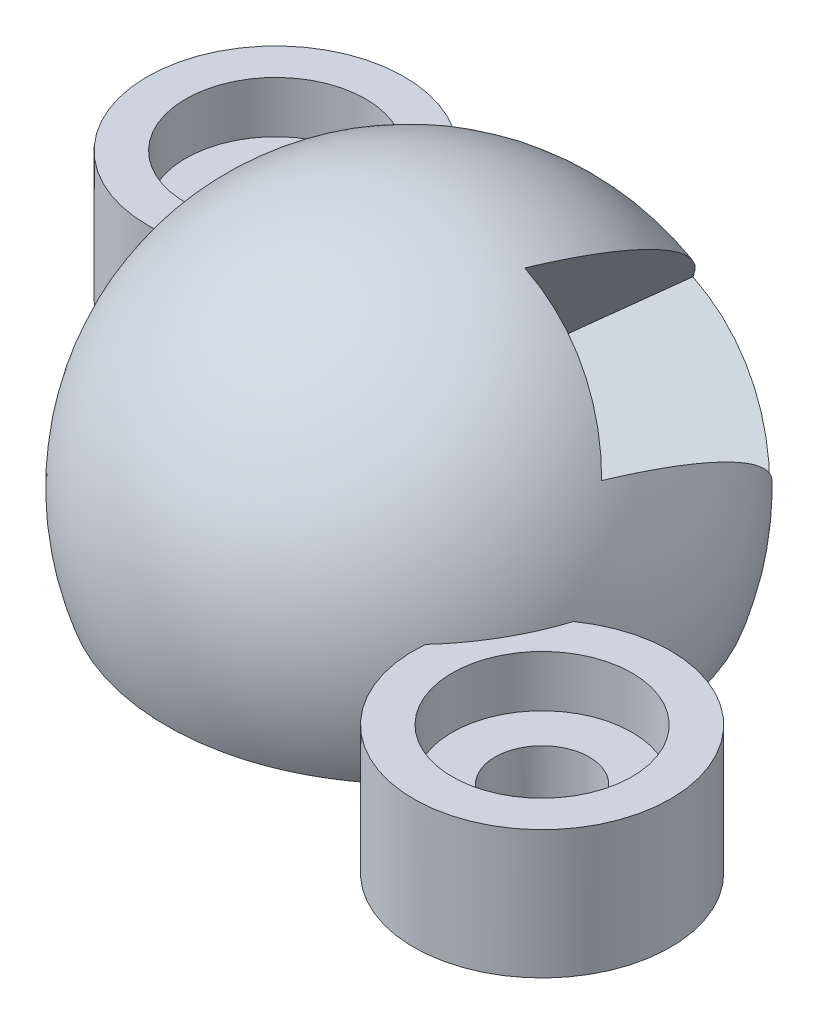
ISO-10303-21;
HEADER;
FILE_DESCRIPTION(('STEP AP214'),'2;1');
FILE_NAME('part.step','',(''),(''),'','','');
FILE_SCHEMA(('AUTOMOTIVE_DESIGN { 1 0 10303 214 1 1 1 1 }'));
ENDSEC;
DATA;
#1=APPLICATION_CONTEXT('core data for automotive mechanical design processes');
#2=APPLICATION_PROTOCOL_DEFINITION('international standard','automotive_design',2000,#1);
#3=PRODUCT_CONTEXT('',#1,'mechanical');
#4=PRODUCT('Part','Part','',(#3));
#5=PRODUCT_RELATED_PRODUCT_CATEGORY('part','',(#4));
#6=PRODUCT_DEFINITION_FORMATION('','',#4);
#7=PRODUCT_DEFINITION_CONTEXT('part definition',#1,'design');
#8=PRODUCT_DEFINITION('design','',#6,#7);
#9=PRODUCT_DEFINITION_SHAPE('','',#8);
#10=(LENGTH_UNIT() NAMED_UNIT(*) SI_UNIT(.MILLI.,.METRE.));
#11=(NAMED_UNIT(*) PLANE_ANGLE_UNIT() SI_UNIT($,.RADIAN.));
#12=(NAMED_UNIT(*) SI_UNIT($,.STERADIAN.) SOLID_ANGLE_UNIT());
#13=UNCERTAINTY_MEASURE_WITH_UNIT(LENGTH_MEASURE(1.E-05),#10,'distance_accuracy_value','');
#14=(GEOMETRIC_REPRESENTATION_CONTEXT(3) GLOBAL_UNCERTAINTY_ASSIGNED_CONTEXT((#13)) GLOBAL_UNIT_ASSIGNED_CONTEXT((#10,
#11,#12)) REPRESENTATION_CONTEXT('',''));
#15=CARTESIAN_POINT('',(0.,0.,0.));
#16=DIRECTION('',(0.,0.,1.));
#17=DIRECTION('',(1.,0.,0.));
#18=AXIS2_PLACEMENT_3D('',#15,#16,#17);
#19=CARTESIAN_POINT('',(-71.2916512459885,73.,25.9807621135332));
#20=DIRECTION('',(0.866025403784439,0.,0.5));
#21=DIRECTION('',(-0.5,0.,0.866025403784439));
#22=AXIS2_PLACEMENT_3D('',#19,#20,#21);
#23=SPHERICAL_SURFACE('',#22,6.);
#24=CARTESIAN_POINT('',(-71.2916512459885,71.,25.9807621135332));
#25=DIRECTION('',(0.,1.,0.));
#26=DIRECTION('',(0.,0.,1.));
#27=AXIS2_PLACEMENT_3D('',#24,#25,#26);
#28=CIRCLE('',#27,5.65685424949238);
#29=CARTESIAN_POINT('',(-66.8289289741654,71.,29.4569827516075));
#30=VERTEX_POINT('',#29);
#31=CARTESIAN_POINT('',(-76.5335077636322,71.,23.8540415751369));
#32=VERTEX_POINT('',#31);
#33=EDGE_CURVE('E240',#30,#32,#28,.F.);
#34=ORIENTED_EDGE('',*,*,#33,.F.);
#35=CARTESIAN_POINT('',(-66.9186680551725,74.0002,29.9653095122776));
#36=CARTESIAN_POINT('',(-66.9199136563757,73.9496620404665,29.9793625650934));
#37=CARTESIAN_POINT('',(-66.9209608975036,73.8988041487702,29.9922417237906));
#38=CARTESIAN_POINT('',(-66.9227416794356,73.7965686087353,30.015716778257));
#39=CARTESIAN_POINT('',(-66.9234752828729,73.7451910662704,30.0263131296908));
#40=CARTESIAN_POINT('',(-66.9253300140908,73.5904873630535,30.0547716000223));
#41=CARTESIAN_POINT('',(-66.9261062928903,73.4865322631475,30.0693190008284));
#42=CARTESIAN_POINT('',(-66.9271532875668,73.275745133254,30.090088390549));
#43=CARTESIAN_POINT('',(-66.9274137418472,73.1688967733631,30.0961407108518));
#44=CARTESIAN_POINT('',(-66.9275636419262,72.9550449188531,30.0995185200987));
#45=CARTESIAN_POINT('',(-66.9274530367347,72.8480414049326,30.0968428096575));
#46=CARTESIAN_POINT('',(-66.9267885610179,72.6348501805666,30.0827161488815));
#47=CARTESIAN_POINT('',(-66.9262356742585,72.5286611870301,30.0712846763609));
#48=CARTESIAN_POINT('',(-66.924369507445,72.3176550384306,30.0394119904845));
#49=CARTESIAN_POINT('',(-66.9230563627963,72.212837642479,30.0189723816714));
#50=CARTESIAN_POINT('',(-66.919086886683,72.0065978326292,29.9688664665963));
#51=CARTESIAN_POINT('',(-66.9164448661654,71.9051512731432,29.9392997358972));
#52=CARTESIAN_POINT('',(-66.9088928448551,71.7058549967529,29.8702026958912));
#53=CARTESIAN_POINT('',(-66.9039848470913,71.6080021854262,29.8306812001712));
#54=CARTESIAN_POINT('',(-66.8906989819315,71.4206435124872,29.742101007917));
#55=CARTESIAN_POINT('',(-66.8824372152422,71.3309707282417,29.6933880964718));
#56=CARTESIAN_POINT('',(-66.8659903007945,71.2020077467898,29.6116573789285));
#57=CARTESIAN_POINT('',(-66.8598003756267,71.1597920463395,29.5828417645339));
#58=CARTESIAN_POINT('',(-66.8457104376269,71.0778030739371,29.522149721747));
#59=CARTESIAN_POINT('',(-66.8378070944615,71.0380347549417,29.4902674007642));
#60=CARTESIAN_POINT('',(-66.8288822258978,70.9997999999986,29.4568076588796));
#61=B_SPLINE_CURVE_WITH_KNOTS('',3,(#35,#36,#37,#38,#39,#40,#41,#42,#43,#44,#45,#46,#47,#48,#49,
#50,#51,#52,#53,#54,#55,#56,#57,#58,#59,#60),.UNSPECIFIED.,.F.,.F.,(4,2,2,2,2,2,2,2,2,2,2,2,4),
(0.,0.157377048485883,0.31472265421785,0.62923445838229,0.949942579700624,1.27069477382297,
1.59073549691185,1.91071923689568,2.22732850930357,2.54365844666373,2.8498625583541,
3.00416307873576,3.15876624238512),.UNSPECIFIED.);
#62=CARTESIAN_POINT('',(-66.9186729955712,74.,29.9653651328284));
#63=VERTEX_POINT('',#62);
#64=EDGE_CURVE('E225',#63,#30,#61,.T.);
#65=ORIENTED_EDGE('',*,*,#64,.F.);
#66=CARTESIAN_POINT('',(-71.2916512459885,74.,25.9807621135332));
#67=DIRECTION('',(0.,-1.,0.));
#68=DIRECTION('',(0.,0.,-1.));
#69=AXIS2_PLACEMENT_3D('',#66,#67,#68);
#70=CIRCLE('',#69,5.91607978309961);
#71=CARTESIAN_POINT('',(-65.654394682074,74.,27.7755708589438));
#72=VERTEX_POINT('',#71);
#73=EDGE_CURVE('E239',#63,#72,#70,.F.);
#74=ORIENTED_EDGE('',*,*,#73,.T.);
#75=CARTESIAN_POINT('',(-66.0499229889631,70.9998000000002,28.107610683484));
#76=CARTESIAN_POINT('',(-66.0319202396732,71.0278724460281,28.0896428856084));
#77=CARTESIAN_POINT('',(-66.0143741117478,71.0567865660781,28.0725798145888));
#78=CARTESIAN_POINT('',(-65.9802335368228,71.1160434934823,28.0401263846795));
#79=CARTESIAN_POINT('',(-65.9636383364959,71.1463851342514,28.0247346928179));
#80=CARTESIAN_POINT('',(-65.915422212628,71.2389943886752,27.9809370845955));
#81=CARTESIAN_POINT('',(-65.8852277395567,71.3030725103162,27.9547686702427));
#82=CARTESIAN_POINT('',(-65.8290421443179,71.4339893832939,27.9076997441562));
#83=CARTESIAN_POINT('',(-65.8030117081901,71.5007937830544,27.8867487748397));
#84=CARTESIAN_POINT('',(-65.7547307338535,71.6369688871942,27.8489804098282));
#85=CARTESIAN_POINT('',(-65.7324848770491,71.7063426425282,27.8321681222303));
#86=CARTESIAN_POINT('',(-65.6854576769207,71.8687142272826,27.7974513387935));
#87=CARTESIAN_POINT('',(-65.6620247886445,71.9623745047607,27.7808211247366));
#88=CARTESIAN_POINT('',(-65.6215043490245,72.1518627703871,27.7526803018685));
#89=CARTESIAN_POINT('',(-65.6044221020261,72.2476925000111,27.7411739711792));
#90=CARTESIAN_POINT('',(-65.5764370517189,72.4413341169987,27.7225831353181));
#91=CARTESIAN_POINT('',(-65.565576968762,72.5391550423466,27.7155291665277));
#92=CARTESIAN_POINT('',(-65.5501574299365,72.7354433347076,27.7055722772024));
#93=CARTESIAN_POINT('',(-65.545594570301,72.833910323568,27.7026671141307));
#94=CARTESIAN_POINT('',(-65.5428479445534,73.0229211548648,27.7009148561056));
#95=CARTESIAN_POINT('',(-65.544173789077,73.1134555342487,27.7017558159865));
#96=CARTESIAN_POINT('',(-65.552112956691,73.2941775183519,27.7068402940624));
#97=CARTESIAN_POINT('',(-65.5587250270998,73.3843652001413,27.7110830061418));
#98=CARTESIAN_POINT('',(-65.577160839089,73.5629332316183,27.7230885453723));
#99=CARTESIAN_POINT('',(-65.5889241330141,73.6513224558665,27.730810573593));
#100=CARTESIAN_POINT('',(-65.6177158947287,73.8268475917444,27.7501687959208));
#101=CARTESIAN_POINT('',(-65.6347470695286,73.9139828348421,27.7618070027086));
#102=CARTESIAN_POINT('',(-65.6544403806847,74.0002,27.7756029477299));
#103=B_SPLINE_CURVE_WITH_KNOTS('',3,(#75,#76,#77,#78,#79,#80,#81,#82,#83,#84,#85,#86,#87,#88,
#89,#90,#91,#92,#93,#94,#95,#96,#97,#98,#99,#100,#101,#102),.UNSPECIFIED.,.F.,.F.,(4,2,2,2,2,2,
2,2,2,2,2,2,2,4),(0.,0.113585797209045,0.227080330731883,0.453169231822996,0.676978393535378,
0.901062418299968,1.19454534747416,1.48827285917165,1.7839936063597,2.07955444826504,
2.35098507155568,2.62235139274866,2.89061526718652,3.15901722427215),.UNSPECIFIED.);
#104=CARTESIAN_POINT('',(-66.0497947283448,71.,28.1074826519294));
#105=VERTEX_POINT('',#104);
#106=EDGE_CURVE('E230',#105,#72,#103,.T.);
#107=ORIENTED_EDGE('',*,*,#106,.F.);
#108=CARTESIAN_POINT('',(-75.7543735178116,71.,22.5045414754588));
#109=VERTEX_POINT('',#108);
#110=EDGE_CURVE('E236',#109,#105,#28,.F.);
#111=ORIENTED_EDGE('',*,*,#110,.F.);
#112=CARTESIAN_POINT('',(-75.6646344368045,74.0002,21.9962147147887));
#113=CARTESIAN_POINT('',(-75.6633888356013,73.9496620404665,21.9821616619729));
#114=CARTESIAN_POINT('',(-75.6623415944734,73.8988041487702,21.9692825032757));
#115=CARTESIAN_POINT('',(-75.6605608125414,73.7965686087353,21.9458074488093));
#116=CARTESIAN_POINT('',(-75.6598272091041,73.7451910662703,21.9352110973755));
#117=CARTESIAN_POINT('',(-75.6579724778862,73.5904873630535,21.906752627044));
#118=CARTESIAN_POINT('',(-75.6571961990867,73.4865322631475,21.8922052262379));
#119=CARTESIAN_POINT('',(-75.6561492044103,73.2757451332539,21.8714358365173));
#120=CARTESIAN_POINT('',(-75.6558887501298,73.1688967733631,21.8653835162145));
#121=CARTESIAN_POINT('',(-75.6557388500508,72.9550449188531,21.8620057069676));
#122=CARTESIAN_POINT('',(-75.6558494552424,72.8480414049326,21.8646814174088));
#123=CARTESIAN_POINT('',(-75.6565139309591,72.6348501805666,21.8788080781848));
#124=CARTESIAN_POINT('',(-75.6570668177186,72.52866118703,21.8902395507054));
#125=CARTESIAN_POINT('',(-75.658932984532,72.3176550384306,21.9221122365818));
#126=CARTESIAN_POINT('',(-75.6602461291807,72.2128376424789,21.942551845395));
#127=CARTESIAN_POINT('',(-75.664215605294,72.0065978326292,21.99265776047));
#128=CARTESIAN_POINT('',(-75.6668576258116,71.9051512731432,22.0222244911691));
#129=CARTESIAN_POINT('',(-75.6744096471219,71.7058549967528,22.0913215311751));
#130=CARTESIAN_POINT('',(-75.6793176448857,71.6080021854261,22.1308430268951));
#131=CARTESIAN_POINT('',(-75.6926035100455,71.4206435124871,22.2194232191493));
#132=CARTESIAN_POINT('',(-75.7008652767348,71.3309707282417,22.2681361305945));
#133=CARTESIAN_POINT('',(-75.7173121911826,71.2020077467897,22.3498668481378));
#134=CARTESIAN_POINT('',(-75.7235021163503,71.1597920463395,22.3786824625324));
#135=CARTESIAN_POINT('',(-75.7375920543501,71.0778030739371,22.4393745053193));
#136=CARTESIAN_POINT('',(-75.7454953975155,71.0380347549418,22.4712568263021));
#137=CARTESIAN_POINT('',(-75.7544202660792,70.9997999999986,22.5047165681867));
#138=B_SPLINE_CURVE_WITH_KNOTS('',3,(#112,#113,#114,#115,#116,#117,#118,#119,#120,#121,#122,
#123,#124,#125,#126,#127,#128,#129,#130,#131,#132,#133,#134,#135,#136,#137),.UNSPECIFIED.,.F.,
.F.,(4,2,2,2,2,2,2,2,2,2,2,2,4),(0.,0.157377048485897,0.314722654217878,0.629234458382303,
0.949942579700638,1.270694773823,1.5907354969119,1.91071923689573,2.22732850930363,
2.54365844666378,2.84986255835413,3.00416307873576,3.15876624238512),.UNSPECIFIED.);
#139=CARTESIAN_POINT('',(-75.6646294964059,74.,21.9961590942379));
#140=VERTEX_POINT('',#139);
#141=EDGE_CURVE('E184',#140,#109,#138,.T.);
#142=ORIENTED_EDGE('',*,*,#141,.F.);
#143=CARTESIAN_POINT('',(-71.2916512459885,74.,25.9807621135332));
#144=DIRECTION('',(0.,-1.,0.));
#145=DIRECTION('',(0.,0.,-1.));
#146=AXIS2_PLACEMENT_3D('',#143,#144,#145);
#147=CIRCLE('',#146,5.91607978309961);
#148=CARTESIAN_POINT('',(-76.9289078099031,74.,24.1859533681225));
#149=VERTEX_POINT('',#148);
#150=EDGE_CURVE('E243',#140,#149,#147,.F.);
#151=ORIENTED_EDGE('',*,*,#150,.T.);
#152=CARTESIAN_POINT('',(-76.533379503014,70.9998000000002,23.8539135435824));
#153=CARTESIAN_POINT('',(-76.5513822523038,71.0278724460281,23.8718813414579));
#154=CARTESIAN_POINT('',(-76.5689283802293,71.0567865660781,23.8889444124775));
#155=CARTESIAN_POINT('',(-76.6030689551543,71.1160434934823,23.9213978423869));
#156=CARTESIAN_POINT('',(-76.6196641554812,71.1463851342514,23.9367895342484));
#157=CARTESIAN_POINT('',(-76.6678802793491,71.2389943886753,23.9805871424709));
#158=CARTESIAN_POINT('',(-76.6980747524204,71.3030725103163,24.0067555568236));
#159=CARTESIAN_POINT('',(-76.7542603476592,71.4339893832939,24.0538244829102));
#160=CARTESIAN_POINT('',(-76.780290783787,71.5007937830545,24.0747754522266));
#161=CARTESIAN_POINT('',(-76.8285717581236,71.6369688871943,24.1125438172381));
#162=CARTESIAN_POINT('',(-76.8508176149279,71.7063426425283,24.129356104836));
#163=CARTESIAN_POINT('',(-76.8978448150564,71.8687142272827,24.1640728882728));
#164=CARTESIAN_POINT('',(-76.9212777033325,71.9623745047607,24.1807031023298));
#165=CARTESIAN_POINT('',(-76.9617981429525,72.1518627703872,24.2088439251978));
#166=CARTESIAN_POINT('',(-76.9788803899509,72.2476925000112,24.2203502558872));
#167=CARTESIAN_POINT('',(-77.0068654402581,72.4413341169988,24.2389410917483));
#168=CARTESIAN_POINT('',(-77.017725523215,72.5391550423466,24.2459950605386));
#169=CARTESIAN_POINT('',(-77.0331450620405,72.7354433347076,24.255951949864));
#170=CARTESIAN_POINT('',(-77.037707921676,72.8339103235681,24.2588571129357));
#171=CARTESIAN_POINT('',(-77.0404545474236,73.0229211548649,24.2606093709607));
#172=CARTESIAN_POINT('',(-77.0391287029001,73.1134555342488,24.2597684110798));
#173=CARTESIAN_POINT('',(-77.0311895352861,73.2941775183519,24.254683933004));
#174=CARTESIAN_POINT('',(-77.0245774648773,73.3843652001414,24.2504412209245));
#175=CARTESIAN_POINT('',(-77.006141652888,73.5629332316183,24.238435681694));
#176=CARTESIAN_POINT('',(-76.994378358963,73.6513224558665,24.2307136534733));
#177=CARTESIAN_POINT('',(-76.9655865972483,73.8268475917444,24.2113554311455));
#178=CARTESIAN_POINT('',(-76.9485554224484,73.9139828348421,24.1997172243577));
#179=CARTESIAN_POINT('',(-76.9288621112924,74.0002,24.1859212793364));
#180=B_SPLINE_CURVE_WITH_KNOTS('',3,(#152,#153,#154,#155,#156,#157,#158,#159,#160,#161,#162,
#163,#164,#165,#166,#167,#168,#169,#170,#171,#172,#173,#174,#175,#176,#177,#178,#179),
.UNSPECIFIED.,.F.,.F.,(4,2,2,2,2,2,2,2,2,2,2,2,2,4),(0.,0.113585797209058,0.227080330731901,
0.453169231823026,0.676978393535421,0.901062418300005,1.19454534747421,1.4882728591717,
1.78399360635975,2.0795544482651,2.35098507155573,2.6223513927487,2.89061526718654,
3.15901722427214),.UNSPECIFIED.);
#181=EDGE_CURVE('E192',#32,#149,#180,.T.);
#182=ORIENTED_EDGE('',*,*,#181,.F.);
#183=EDGE_LOOP('',(#34,#65,#74,#107,#111,#142,#151,#182));
#184=FACE_BOUND('',#183,.T.);
#185=CARTESIAN_POINT('',(-69.9233645908581,71.7684504931306,26.4509508432172));
#186=DIRECTION('',(0.720150871121255,-0.648183950983878,0.247467752465302));
#187=DIRECTION('',(0.668992197049259,0.743269426444546,0.));
#188=AXIS2_PLACEMENT_3D('',#185,#186,#187);
#189=CIRCLE('',#188,5.69122131005287);
#190=CARTESIAN_POINT('',(-66.1498224819875,76.0254293010476,26.6198039791837));
#191=VERTEX_POINT('',#190);
#192=CARTESIAN_POINT('',(-67.4543686143179,72.5784404179814,21.3875552247149));
#193=VERTEX_POINT('',#192);
#194=EDGE_CURVE('E163',#191,#193,#189,.F.);
#195=ORIENTED_EDGE('',*,*,#194,.F.);
#196=CARTESIAN_POINT('',(-70.6393781798233,74.7234944415331,28.5968864907675));
#197=DIRECTION('',(0.203835333176628,0.5385920129791,0.817538867885738));
#198=DIRECTION('',(0.,-0.835071027621469,0.550142144202045));
#199=AXIS2_PLACEMENT_3D('',#196,#197,#198);
#200=CIRCLE('',#199,5.0754310161798);
#201=CARTESIAN_POINT('',(-68.8863957922483,78.4885283147863,25.6794265198155));
#202=VERTEX_POINT('',#201);
#203=EDGE_CURVE('E11',#202,#191,#200,.F.);
#204=ORIENTED_EDGE('',*,*,#203,.F.);
#205=CARTESIAN_POINT('',(-72.6599379011189,74.2315495068694,25.5105733838491));
#206=DIRECTION('',(-0.720150871121255,0.648183950983876,-0.247467752465304));
#207=DIRECTION('',(-0.668992197049259,-0.743269426444547,0.));
#208=AXIS2_PLACEMENT_3D('',#205,#206,#207);
#209=CIRCLE('',#208,5.69122131005288);
#210=CARTESIAN_POINT('',(-70.1909419245787,75.0415394317201,20.4471777653468));
#211=VERTEX_POINT('',#210);
#212=EDGE_CURVE('E160',#211,#202,#209,.F.);
#213=ORIENTED_EDGE('',*,*,#212,.F.);
#214=CARTESIAN_POINT('',(-71.9439243121537,71.2765055584669,23.3646377362988));
#215=DIRECTION('',(-0.203835333176625,-0.538592012979102,-0.817538867885737));
#216=DIRECTION('',(0.,0.835071027621468,-0.550142144202047));
#217=AXIS2_PLACEMENT_3D('',#214,#215,#216);
#218=CIRCLE('',#217,5.07543101617981);
#219=EDGE_CURVE('E161',#193,#211,#218,.F.);
#220=ORIENTED_EDGE('',*,*,#219,.F.);
#221=EDGE_LOOP('',(#195,#204,#213,#220));
#222=FACE_BOUND('',#221,.T.);
#223=ADVANCED_FACE('F41',(#184,#222),#23,.T.);
#224=CARTESIAN_POINT('',(-73.8538290724796,71.,16.4185842870421));
#225=DIRECTION('',(0.,-1.,0.));
#226=DIRECTION('',(0.,0.,1.));
#227=AXIS2_PLACEMENT_3D('',#224,#225,#226);
#228=PLANE('',#227);
#229=CARTESIAN_POINT('',(-78.6528671781562,71.,21.7307621135332));
#230=DIRECTION('',(0.,1.,0.));
#231=DIRECTION('',(0.,0.,1.));
#232=AXIS2_PLACEMENT_3D('',#229,#230,#231);
#233=CIRCLE('',#232,1.1);
#234=CARTESIAN_POINT('',(-78.6528671781562,71.,22.8307621135332));
#235=VERTEX_POINT('',#234);
#236=EDGE_CURVE('E167',#235,#235,#233,.F.);
#237=ORIENTED_EDGE('',*,*,#236,.F.);
#238=EDGE_LOOP('',(#237));
#239=FACE_BOUND('',#238,.T.);
#240=CARTESIAN_POINT('',(-63.9304353138208,71.,30.2307621135332));
#241=DIRECTION('',(0.,1.,0.));
#242=DIRECTION('',(0.,0.,1.));
#243=AXIS2_PLACEMENT_3D('',#240,#241,#242);
#244=CIRCLE('',#243,1.1);
#245=CARTESIAN_POINT('',(-63.9304353138208,71.,31.3307621135332));
#246=VERTEX_POINT('',#245);
#247=EDGE_CURVE('E178',#246,#246,#244,.F.);
#248=ORIENTED_EDGE('',*,*,#247,.F.);
#249=EDGE_LOOP('',(#248));
#250=FACE_BOUND('',#249,.T.);
#251=ORIENTED_EDGE('',*,*,#110,.T.);
#252=CARTESIAN_POINT('',(-63.9304353138208,71.,30.2307621135332));
#253=DIRECTION('',(0.,-1.,0.));
#254=DIRECTION('',(0.,0.,-1.));
#255=AXIS2_PLACEMENT_3D('',#252,#253,#254);
#256=CIRCLE('',#255,3.);
#257=EDGE_CURVE('E449',#105,#30,#256,.T.);
#258=ORIENTED_EDGE('',*,*,#257,.T.);
#259=ORIENTED_EDGE('',*,*,#33,.T.);
#260=CARTESIAN_POINT('',(-78.6528671781562,71.,21.7307621135332));
#261=DIRECTION('',(0.,-1.,0.));
#262=DIRECTION('',(0.,0.,-1.));
#263=AXIS2_PLACEMENT_3D('',#260,#261,#262);
#264=CIRCLE('',#263,3.);
#265=EDGE_CURVE('E187',#32,#109,#264,.T.);
#266=ORIENTED_EDGE('',*,*,#265,.T.);
#267=EDGE_LOOP('',(#251,#258,#259,#266));
#268=FACE_BOUND('',#267,.T.);
#269=DIRECTION('',(0.970295726275997,0.,-0.241921895599667));
#270=VECTOR('',#269,1.);
#271=CARTESIAN_POINT('',(-72.0688026125478,71.,23.5779343783935));
#272=LINE('',#271,#270);
#273=CARTESIAN_POINT('',(-71.6367187442011,71.,23.4702037704379));
#274=VERTEX_POINT('',#273);
#275=CARTESIAN_POINT('',(-69.3990173667522,71.,22.9122821550391));
#276=VERTEX_POINT('',#275);
#277=EDGE_CURVE('E47',#274,#276,#272,.T.);
#278=ORIENTED_EDGE('',*,*,#277,.F.);
#279=DIRECTION('',(-0.617017715423196,0.,-0.786949260660393));
#280=VECTOR('',#279,1.);
#281=CARTESIAN_POINT('',(-75.9047926120562,71.,18.0266686971397));
#282=LINE('',#281,#280);
#283=CARTESIAN_POINT('',(-71.5643738852894,71.,23.5624729740768));
#284=VERTEX_POINT('',#283);
#285=EDGE_CURVE('E152',#284,#274,#282,.T.);
#286=ORIENTED_EDGE('',*,*,#285,.F.);
#287=CARTESIAN_POINT('',(-71.2916512459885,71.,25.9807621135332));
#288=DIRECTION('',(0.,1.,0.));
#289=DIRECTION('',(0.,0.,1.));
#290=AXIS2_PLACEMENT_3D('',#287,#288,#289);
#291=CIRCLE('',#290,2.4336187047276);
#292=CARTESIAN_POINT('',(-69.794226548259,71.,24.0623723526583));
#293=VERTEX_POINT('',#292);
#294=EDGE_CURVE('E181',#284,#293,#291,.T.);
#295=ORIENTED_EDGE('',*,*,#294,.T.);
#296=DIRECTION('',(-0.3249809845209,0.,0.945720550532675));
#297=VECTOR('',#296,1.);
#298=CARTESIAN_POINT('',(-67.8737209264594,71.,18.4735480199762));
#299=LINE('',#298,#297);
#300=EDGE_CURVE('E156',#276,#293,#299,.T.);
#301=ORIENTED_EDGE('',*,*,#300,.F.);
#302=EDGE_LOOP('',(#278,#286,#295,#301));
#303=FACE_BOUND('',#302,.T.);
#304=ADVANCED_FACE('F217',(#239,#250,#268,#303),#228,.T.);
#305=CARTESIAN_POINT('',(-71.2916512459885,73.,25.9807621135332));
#306=DIRECTION('',(0.866025403784439,0.,0.5));
#307=DIRECTION('',(0.5,0.,-0.866025403784439));
#308=AXIS2_PLACEMENT_3D('',#305,#306,#307);
#309=SPHERICAL_SURFACE('',#308,3.15);
#310=CARTESIAN_POINT('',(-71.2916512459885,73.,25.9807621135332));
#311=DIRECTION('',(-0.663199728416764,-0.538308656109163,0.519990298934391));
#312=DIRECTION('',(0.63021095464535,-0.776423951617283,0.));
#313=AXIS2_PLACEMENT_3D('',#310,#311,#312);
#314=CIRCLE('',#313,3.15);
#315=CARTESIAN_POINT('',(-73.1720678375226,72.8783538216271,23.4565323994282));
#316=VERTEX_POINT('',#315);
#317=EDGE_CURVE('E258',#284,#316,#314,.F.);
#318=ORIENTED_EDGE('',*,*,#317,.T.);
#319=CARTESIAN_POINT('',(-72.6599379011189,74.2315495068694,25.5105733838491));
#320=DIRECTION('',(-0.720150871121255,0.648183950983876,-0.247467752465304));
#321=DIRECTION('',(-0.668992197049259,-0.743269426444547,0.));
#322=AXIS2_PLACEMENT_3D('',#319,#320,#321);
#323=CIRCLE('',#322,2.51246890528022);
#324=CARTESIAN_POINT('',(-72.1478079647152,75.5847451921116,27.56461436827));
#325=VERTEX_POINT('',#324);
#326=EDGE_CURVE('E260',#316,#325,#323,.F.);
#327=ORIENTED_EDGE('',*,*,#326,.T.);
#328=CARTESIAN_POINT('',(-69.4112346544544,73.1216461783729,28.5049918276382));
#329=VERTEX_POINT('',#328);
#330=EDGE_CURVE('E246',#325,#329,#314,.F.);
#331=ORIENTED_EDGE('',*,*,#330,.T.);
#332=CARTESIAN_POINT('',(-69.9233645908581,71.7684504931306,26.4509508432172));
#333=DIRECTION('',(0.720150871121255,-0.648183950983878,0.247467752465302));
#334=DIRECTION('',(0.668992197049259,0.743269426444546,0.));
#335=AXIS2_PLACEMENT_3D('',#332,#333,#334);
#336=CIRCLE('',#335,2.51246890528021);
#337=EDGE_CURVE('E140',#329,#293,#336,.F.);
#338=ORIENTED_EDGE('',*,*,#337,.T.);
#339=ORIENTED_EDGE('',*,*,#294,.F.);
#340=EDGE_LOOP('',(#318,#327,#331,#338,#339));
#341=FACE_BOUND('',#340,.T.);
#342=ADVANCED_FACE('F269',(#341),#309,.F.);
#343=CARTESIAN_POINT('',(-78.6528671781562,74.25,21.7307621135332));
#344=DIRECTION('',(0.,-1.,0.));
#345=DIRECTION('',(0.,0.,1.));
#346=AXIS2_PLACEMENT_3D('',#343,#344,#345);
#347=CYLINDRICAL_SURFACE('',#346,1.1);
#348=ORIENTED_EDGE('',*,*,#236,.T.);
#349=EDGE_LOOP('',(#348));
#350=FACE_BOUND('',#349,.T.);
#351=CARTESIAN_POINT('',(-78.6528671781562,72.8,21.7307621135332));
#352=DIRECTION('',(0.,-1.,0.));
#353=DIRECTION('',(0.,0.,-1.));
#354=AXIS2_PLACEMENT_3D('',#351,#352,#353);
#355=CIRCLE('',#354,1.1);
#356=CARTESIAN_POINT('',(-78.6528671781562,72.8,20.6307621135332));
#357=VERTEX_POINT('',#356);
#358=EDGE_CURVE('E169',#357,#357,#355,.T.);
#359=ORIENTED_EDGE('',*,*,#358,.F.);
#360=EDGE_LOOP('',(#359));
#361=FACE_BOUND('',#360,.T.);
#362=ADVANCED_FACE('F311',(#350,#361),#347,.F.);
#363=CARTESIAN_POINT('',(-63.9304353138208,74.25,30.2307621135332));
#364=DIRECTION('',(0.,-1.,0.));
#365=DIRECTION('',(0.,0.,1.));
#366=AXIS2_PLACEMENT_3D('',#363,#364,#365);
#367=CYLINDRICAL_SURFACE('',#366,1.1);
#368=ORIENTED_EDGE('',*,*,#247,.T.);
#369=EDGE_LOOP('',(#368));
#370=FACE_BOUND('',#369,.T.);
#371=CARTESIAN_POINT('',(-63.9304353138208,72.8,30.2307621135332));
#372=DIRECTION('',(0.,-1.,0.));
#373=DIRECTION('',(0.,0.,-1.));
#374=AXIS2_PLACEMENT_3D('',#371,#372,#373);
#375=CIRCLE('',#374,1.1);
#376=CARTESIAN_POINT('',(-63.9304353138208,72.8,29.1307621135332));
#377=VERTEX_POINT('',#376);
#378=EDGE_CURVE('E180',#377,#377,#375,.T.);
#379=ORIENTED_EDGE('',*,*,#378,.F.);
#380=EDGE_LOOP('',(#379));
#381=FACE_BOUND('',#380,.T.);
#382=ADVANCED_FACE('F220',(#370,#381),#367,.F.);
#383=CARTESIAN_POINT('',(-63.9304353138208,74.,30.2307621135332));
#384=DIRECTION('',(0.,-1.,0.));
#385=DIRECTION('',(0.,0.,1.));
#386=AXIS2_PLACEMENT_3D('',#383,#384,#385);
#387=CYLINDRICAL_SURFACE('',#386,3.);
#388=ORIENTED_EDGE('',*,*,#106,.T.);
#389=CARTESIAN_POINT('',(-63.9304353138208,74.,30.2307621135332));
#390=DIRECTION('',(0.,-1.,0.));
#391=DIRECTION('',(0.,0.,-1.));
#392=AXIS2_PLACEMENT_3D('',#389,#390,#391);
#393=CIRCLE('',#392,3.);
#394=EDGE_CURVE('E453',#72,#63,#393,.T.);
#395=ORIENTED_EDGE('',*,*,#394,.T.);
#396=ORIENTED_EDGE('',*,*,#64,.T.);
#397=ORIENTED_EDGE('',*,*,#257,.F.);
#398=EDGE_LOOP('',(#388,#395,#396,#397));
#399=FACE_BOUND('',#398,.T.);
#400=ADVANCED_FACE('F215',(#399),#387,.T.);
#401=CARTESIAN_POINT('',(-63.9304353138208,74.,30.2307621135332));
#402=DIRECTION('',(0.,1.,0.));
#403=DIRECTION('',(0.,0.,-1.));
#404=AXIS2_PLACEMENT_3D('',#401,#402,#403);
#405=PLANE('',#404);
#406=CARTESIAN_POINT('',(-63.9304353138208,74.,30.2307621135332));
#407=DIRECTION('',(0.,-1.,0.));
#408=DIRECTION('',(0.,0.,-1.));
#409=AXIS2_PLACEMENT_3D('',#406,#407,#408);
#410=CIRCLE('',#409,2.1);
#411=CARTESIAN_POINT('',(-63.9304353138208,74.,28.1307621135332));
#412=VERTEX_POINT('',#411);
#413=EDGE_CURVE('E185',#412,#412,#410,.F.);
#414=ORIENTED_EDGE('',*,*,#413,.F.);
#415=EDGE_LOOP('',(#414));
#416=FACE_BOUND('',#415,.T.);
#417=ORIENTED_EDGE('',*,*,#394,.F.);
#418=ORIENTED_EDGE('',*,*,#73,.F.);
#419=EDGE_LOOP('',(#417,#418));
#420=FACE_BOUND('',#419,.T.);
#421=ADVANCED_FACE('F210',(#416,#420),#405,.T.);
#422=CARTESIAN_POINT('',(-78.6528671781562,74.,21.7307621135332));
#423=DIRECTION('',(0.,-1.,0.));
#424=DIRECTION('',(0.,0.,1.));
#425=AXIS2_PLACEMENT_3D('',#422,#423,#424);
#426=CYLINDRICAL_SURFACE('',#425,3.);
#427=ORIENTED_EDGE('',*,*,#181,.T.);
#428=CARTESIAN_POINT('',(-78.6528671781562,74.,21.7307621135332));
#429=DIRECTION('',(0.,-1.,0.));
#430=DIRECTION('',(0.,0.,-1.));
#431=AXIS2_PLACEMENT_3D('',#428,#429,#430);
#432=CIRCLE('',#431,3.);
#433=EDGE_CURVE('E182',#149,#140,#432,.T.);
#434=ORIENTED_EDGE('',*,*,#433,.T.);
#435=ORIENTED_EDGE('',*,*,#141,.T.);
#436=ORIENTED_EDGE('',*,*,#265,.F.);
#437=EDGE_LOOP('',(#427,#434,#435,#436));
#438=FACE_BOUND('',#437,.T.);
#439=ADVANCED_FACE('F202',(#438),#426,.T.);
#440=CARTESIAN_POINT('',(-78.6528671781562,74.,21.7307621135332));
#441=DIRECTION('',(0.,1.,0.));
#442=DIRECTION('',(0.,0.,-1.));
#443=AXIS2_PLACEMENT_3D('',#440,#441,#442);
#444=PLANE('',#443);
#445=CARTESIAN_POINT('',(-78.6528671781562,74.,21.7307621135332));
#446=DIRECTION('',(0.,-1.,0.));
#447=DIRECTION('',(0.,0.,-1.));
#448=AXIS2_PLACEMENT_3D('',#445,#446,#447);
#449=CIRCLE('',#448,2.1);
#450=CARTESIAN_POINT('',(-78.6528671781562,74.,19.6307621135332));
#451=VERTEX_POINT('',#450);
#452=EDGE_CURVE('E172',#451,#451,#449,.F.);
#453=ORIENTED_EDGE('',*,*,#452,.F.);
#454=EDGE_LOOP('',(#453));
#455=FACE_BOUND('',#454,.T.);
#456=ORIENTED_EDGE('',*,*,#433,.F.);
#457=ORIENTED_EDGE('',*,*,#150,.F.);
#458=EDGE_LOOP('',(#456,#457));
#459=FACE_BOUND('',#458,.T.);
#460=ADVANCED_FACE('F207',(#455,#459),#444,.T.);
#461=CARTESIAN_POINT('',(-63.9304353138208,74.25,30.2307621135332));
#462=DIRECTION('',(0.,-1.,0.));
#463=DIRECTION('',(0.,0.,1.));
#464=AXIS2_PLACEMENT_3D('',#461,#462,#463);
#465=CYLINDRICAL_SURFACE('',#464,2.1);
#466=ORIENTED_EDGE('',*,*,#413,.T.);
#467=EDGE_LOOP('',(#466));
#468=FACE_BOUND('',#467,.T.);
#469=CARTESIAN_POINT('',(-63.9304353138208,72.8,30.2307621135332));
#470=DIRECTION('',(0.,-1.,0.));
#471=DIRECTION('',(0.,0.,-1.));
#472=AXIS2_PLACEMENT_3D('',#469,#470,#471);
#473=CIRCLE('',#472,2.1);
#474=CARTESIAN_POINT('',(-63.9304353138208,72.8,28.1307621135332));
#475=VERTEX_POINT('',#474);
#476=EDGE_CURVE('E173',#475,#475,#473,.T.);
#477=ORIENTED_EDGE('',*,*,#476,.T.);
#478=EDGE_LOOP('',(#477));
#479=FACE_BOUND('',#478,.T.);
#480=ADVANCED_FACE('F320',(#468,#479),#465,.F.);
#481=CARTESIAN_POINT('',(-63.9304353138208,72.8,30.2307621135332));
#482=DIRECTION('',(0.,1.,0.));
#483=DIRECTION('',(0.,0.,-1.));
#484=AXIS2_PLACEMENT_3D('',#481,#482,#483);
#485=PLANE('',#484);
#486=ORIENTED_EDGE('',*,*,#378,.T.);
#487=EDGE_LOOP('',(#486));
#488=FACE_BOUND('',#487,.T.);
#489=ORIENTED_EDGE('',*,*,#476,.F.);
#490=EDGE_LOOP('',(#489));
#491=FACE_BOUND('',#490,.T.);
#492=ADVANCED_FACE('F307',(#488,#491),#485,.T.);
#493=CARTESIAN_POINT('',(-78.6528671781562,74.25,21.7307621135332));
#494=DIRECTION('',(0.,-1.,0.));
#495=DIRECTION('',(0.,0.,1.));
#496=AXIS2_PLACEMENT_3D('',#493,#494,#495);
#497=CYLINDRICAL_SURFACE('',#496,2.1);
#498=ORIENTED_EDGE('',*,*,#452,.T.);
#499=EDGE_LOOP('',(#498));
#500=FACE_BOUND('',#499,.T.);
#501=CARTESIAN_POINT('',(-78.6528671781562,72.8,21.7307621135332));
#502=DIRECTION('',(0.,-1.,0.));
#503=DIRECTION('',(0.,0.,-1.));
#504=AXIS2_PLACEMENT_3D('',#501,#502,#503);
#505=CIRCLE('',#504,2.1);
#506=CARTESIAN_POINT('',(-78.6528671781562,72.8,19.6307621135332));
#507=VERTEX_POINT('',#506);
#508=EDGE_CURVE('E168',#507,#507,#505,.T.);
#509=ORIENTED_EDGE('',*,*,#508,.T.);
#510=EDGE_LOOP('',(#509));
#511=FACE_BOUND('',#510,.T.);
#512=ADVANCED_FACE('F285',(#500,#511),#497,.F.);
#513=CARTESIAN_POINT('',(-78.6528671781562,72.8,21.7307621135332));
#514=DIRECTION('',(0.,1.,0.));
#515=DIRECTION('',(0.,0.,-1.));
#516=AXIS2_PLACEMENT_3D('',#513,#514,#515);
#517=PLANE('',#516);
#518=ORIENTED_EDGE('',*,*,#358,.T.);
#519=EDGE_LOOP('',(#518));
#520=FACE_BOUND('',#519,.T.);
#521=ORIENTED_EDGE('',*,*,#508,.F.);
#522=EDGE_LOOP('',(#521));
#523=FACE_BOUND('',#522,.T.);
#524=ADVANCED_FACE('F274',(#520,#523),#517,.T.);
#525=CARTESIAN_POINT('',(-65.3756675507861,81.3381305094941,22.9267947717396));
#526=DIRECTION('',(0.720150871121255,-0.648183950983876,0.247467752465304));
#527=DIRECTION('',(-0.668992197049259,-0.743269426444547,0.));
#528=AXIS2_PLACEMENT_3D('',#525,#526,#527);
#529=PLANE('',#528);
#530=DIRECTION('',(-0.663199728416764,-0.538308656109163,0.519990298934391));
#531=VECTOR('',#530,1.);
#532=CARTESIAN_POINT('',(-66.6802136831165,77.8911416264279,17.6945460172708));
#533=LINE('',#532,#531);
#534=CARTESIAN_POINT('',(-73.3122109672841,72.5080550653362,22.8944490066147));
#535=VERTEX_POINT('',#534);
#536=EDGE_CURVE('E148',#211,#535,#533,.T.);
#537=ORIENTED_EDGE('',*,*,#536,.F.);
#538=ORIENTED_EDGE('',*,*,#212,.T.);
#539=DIRECTION('',(-0.663199728416764,-0.538308656109163,0.519990298934391));
#540=VECTOR('',#539,1.);
#541=CARTESIAN_POINT('',(-65.3756675507861,81.3381305094941,22.9267947717396));
#542=LINE('',#541,#540);
#543=CARTESIAN_POINT('',(-72.0076648349537,75.9550439484025,28.1266977610835));
#544=VERTEX_POINT('',#543);
#545=EDGE_CURVE('E54',#202,#544,#542,.T.);
#546=ORIENTED_EDGE('',*,*,#545,.T.);
#547=DIRECTION('',(-0.203835333176627,-0.5385920129791,-0.817538867885738));
#548=VECTOR('',#547,1.);
#549=CARTESIAN_POINT('',(-72.0076648349537,75.9550439484025,28.1266977610835));
#550=LINE('',#549,#548);
#551=EDGE_CURVE('E61',#544,#325,#550,.T.);
#552=ORIENTED_EDGE('',*,*,#551,.T.);
#553=ORIENTED_EDGE('',*,*,#326,.F.);
#554=EDGE_CURVE('E141',#316,#535,#550,.T.);
#555=ORIENTED_EDGE('',*,*,#554,.T.);
#556=EDGE_LOOP('',(#537,#538,#546,#552,#553,#555));
#557=FACE_BOUND('',#556,.T.);
#558=ADVANCED_FACE('F275',(#557),#529,.T.);
#559=CARTESIAN_POINT('',(-14.2546930046118,-11.570307263062,11.1765758625704));
#560=DIRECTION('',(0.663199728416764,0.538308656109163,-0.519990298934391));
#561=DIRECTION('',(0.63021095464535,-0.776423951617283,0.));
#562=AXIS2_PLACEMENT_3D('',#559,#560,#561);
#563=PLANE('',#562);
#564=ORIENTED_EDGE('',*,*,#330,.F.);
#565=ORIENTED_EDGE('',*,*,#551,.F.);
#566=DIRECTION('',(-0.720150871121257,0.648183950983875,-0.247467752465302));
#567=VECTOR('',#566,1.);
#568=CARTESIAN_POINT('',(-69.2710915246929,73.4919449346637,29.0670752204516));
#569=LINE('',#568,#567);
#570=CARTESIAN_POINT('',(-69.2710915246929,73.4919449346637,29.0670752204516));
#571=VERTEX_POINT('',#570);
#572=EDGE_CURVE('E129',#571,#544,#569,.T.);
#573=ORIENTED_EDGE('',*,*,#572,.F.);
#574=DIRECTION('',(0.203835333176629,0.538592012979099,0.817538867885739));
#575=VECTOR('',#574,1.);
#576=CARTESIAN_POINT('',(-70.5756376570233,70.0449560515975,23.8348264659829));
#577=LINE('',#576,#575);
#578=EDGE_CURVE('E132',#329,#571,#577,.T.);
#579=ORIENTED_EDGE('',*,*,#578,.F.);
#580=EDGE_LOOP('',(#564,#565,#573,#579));
#581=FACE_BOUND('',#580,.T.);
#582=ADVANCED_FACE('F145',(#581),#563,.T.);
#583=CARTESIAN_POINT('',(-66.6802136831165,77.8911416264279,17.6945460172708));
#584=DIRECTION('',(0.203835333176625,0.538592012979102,0.817538867885737));
#585=DIRECTION('',(0.,0.835071027621468,-0.550142144202047));
#586=AXIS2_PLACEMENT_3D('',#583,#584,#585);
#587=PLANE('',#586);
#588=DIRECTION('',(-0.663199728416764,-0.538308656109163,0.519990298934391));
#589=VECTOR('',#588,1.);
#590=CARTESIAN_POINT('',(-63.9436403728557,75.4280426126891,18.634923476639));
#591=LINE('',#590,#589);
#592=EDGE_CURVE('E131',#193,#276,#591,.T.);
#593=ORIENTED_EDGE('',*,*,#592,.F.);
#594=ORIENTED_EDGE('',*,*,#219,.T.);
#595=ORIENTED_EDGE('',*,*,#536,.T.);
#596=DIRECTION('',(0.720150871121257,-0.648183950983874,0.247467752465306));
#597=VECTOR('',#596,1.);
#598=CARTESIAN_POINT('',(-73.3122109672841,72.5080550653362,22.8944490066147));
#599=LINE('',#598,#597);
#600=EDGE_CURVE('E138',#535,#274,#599,.T.);
#601=ORIENTED_EDGE('',*,*,#600,.T.);
#602=ORIENTED_EDGE('',*,*,#277,.T.);
#603=EDGE_LOOP('',(#593,#594,#595,#601,#602));
#604=FACE_BOUND('',#603,.T.);
#605=ADVANCED_FACE('F277',(#604),#587,.T.);
#606=CARTESIAN_POINT('',(-63.9436403728557,75.4280426126891,18.634923476639));
#607=DIRECTION('',(-0.720150871121255,0.648183950983878,-0.247467752465302));
#608=DIRECTION('',(0.668992197049259,0.743269426444546,0.));
#609=AXIS2_PLACEMENT_3D('',#606,#607,#608);
#610=PLANE('',#609);
#611=DIRECTION('',(-0.663199728416764,-0.538308656109163,0.519990298934391));
#612=VECTOR('',#611,1.);
#613=CARTESIAN_POINT('',(-62.6390942405253,78.8750314957554,23.8671722311077));
#614=LINE('',#613,#612);
#615=EDGE_CURVE('E125',#191,#571,#614,.T.);
#616=ORIENTED_EDGE('',*,*,#615,.F.);
#617=ORIENTED_EDGE('',*,*,#194,.T.);
#618=ORIENTED_EDGE('',*,*,#592,.T.);
#619=ORIENTED_EDGE('',*,*,#300,.T.);
#620=ORIENTED_EDGE('',*,*,#337,.F.);
#621=ORIENTED_EDGE('',*,*,#578,.T.);
#622=EDGE_LOOP('',(#616,#617,#618,#619,#620,#621));
#623=FACE_BOUND('',#622,.T.);
#624=ADVANCED_FACE('F134',(#623),#610,.T.);
#625=CARTESIAN_POINT('',(-62.6390942405253,78.8750314957554,23.8671722311077));
#626=DIRECTION('',(-0.203835333176628,-0.5385920129791,-0.817538867885738));
#627=DIRECTION('',(0.,-0.835071027621469,0.550142144202045));
#628=AXIS2_PLACEMENT_3D('',#625,#626,#627);
#629=PLANE('',#628);
#630=ORIENTED_EDGE('',*,*,#545,.F.);
#631=ORIENTED_EDGE('',*,*,#203,.T.);
#632=ORIENTED_EDGE('',*,*,#615,.T.);
#633=ORIENTED_EDGE('',*,*,#572,.T.);
#634=EDGE_LOOP('',(#630,#631,#632,#633));
#635=FACE_BOUND('',#634,.T.);
#636=ADVANCED_FACE('F121',(#635),#629,.T.);
#637=ORIENTED_EDGE('',*,*,#317,.F.);
#638=ORIENTED_EDGE('',*,*,#285,.T.);
#639=ORIENTED_EDGE('',*,*,#600,.F.);
#640=ORIENTED_EDGE('',*,*,#554,.F.);
#641=EDGE_LOOP('',(#637,#638,#639,#640));
#642=FACE_BOUND('',#641,.T.);
#643=ADVANCED_FACE('F272',(#642),#563,.T.);
#644=CLOSED_SHELL('',(#223,#304,#342,#362,#382,#400,#421,#439,#460,#480,#492,#512,#524,#558,
#582,#605,#624,#636,#643));
#645=MANIFOLD_SOLID_BREP('B2',#644);
#646=ADVANCED_BREP_SHAPE_REPRESENTATION('',(#18,#645),#14);
#647=SHAPE_DEFINITION_REPRESENTATION(#9,#646);
ENDSEC;
END-ISO-10303-21;
